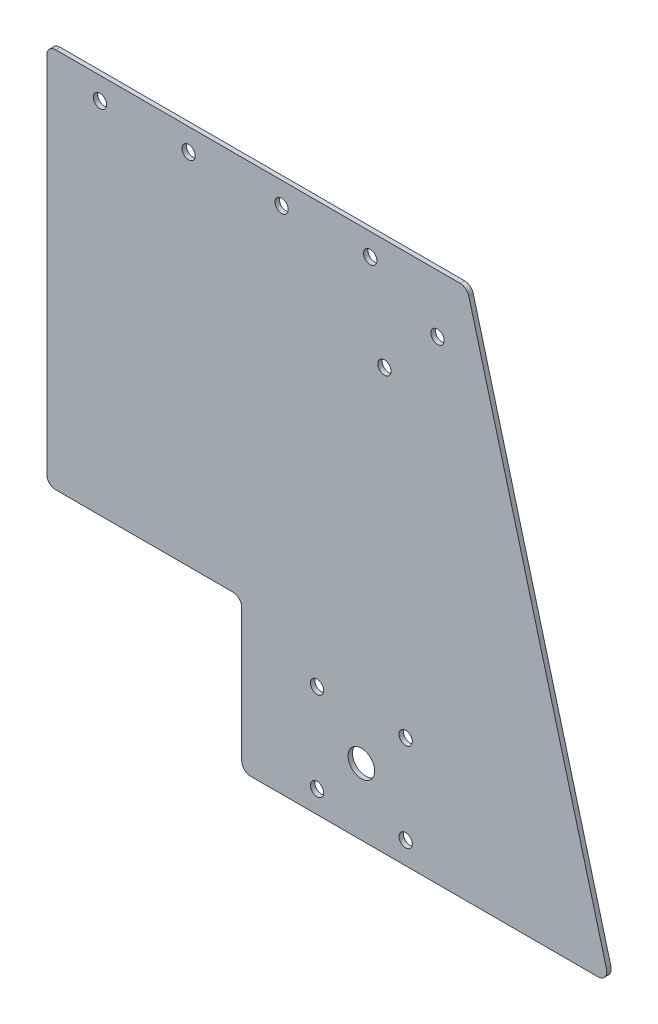
ISO-10303-21;
HEADER;
FILE_DESCRIPTION(('STEP AP214'),'2;1');
FILE_NAME('part.step','',(''),(''),'','','');
FILE_SCHEMA(('AUTOMOTIVE_DESIGN { 1 0 10303 214 1 1 1 1 }'));
ENDSEC;
DATA;
#1=APPLICATION_CONTEXT('core data for automotive mechanical design processes');
#2=APPLICATION_PROTOCOL_DEFINITION('international standard','automotive_design',2000,#1);
#3=PRODUCT_CONTEXT('',#1,'mechanical');
#4=PRODUCT('Part','Part','',(#3));
#5=PRODUCT_RELATED_PRODUCT_CATEGORY('part','',(#4));
#6=PRODUCT_DEFINITION_FORMATION('','',#4);
#7=PRODUCT_DEFINITION_CONTEXT('part definition',#1,'design');
#8=PRODUCT_DEFINITION('design','',#6,#7);
#9=PRODUCT_DEFINITION_SHAPE('','',#8);
#10=(LENGTH_UNIT() NAMED_UNIT(*) SI_UNIT(.MILLI.,.METRE.));
#11=(NAMED_UNIT(*) PLANE_ANGLE_UNIT() SI_UNIT($,.RADIAN.));
#12=(NAMED_UNIT(*) SI_UNIT($,.STERADIAN.) SOLID_ANGLE_UNIT());
#13=UNCERTAINTY_MEASURE_WITH_UNIT(LENGTH_MEASURE(1.E-05),#10,'distance_accuracy_value','');
#14=(GEOMETRIC_REPRESENTATION_CONTEXT(3) GLOBAL_UNCERTAINTY_ASSIGNED_CONTEXT((#13)) GLOBAL_UNIT_ASSIGNED_CONTEXT((#10,
#11,#12)) REPRESENTATION_CONTEXT('',''));
#15=CARTESIAN_POINT('',(0.,0.,0.));
#16=DIRECTION('',(0.,0.,1.));
#17=DIRECTION('',(1.,0.,0.));
#18=AXIS2_PLACEMENT_3D('',#15,#16,#17);
#19=CARTESIAN_POINT('',(0.,0.,1.));
#20=DIRECTION('',(0.,0.,1.));
#21=DIRECTION('',(1.,0.,0.));
#22=AXIS2_PLACEMENT_3D('',#19,#20,#21);
#23=PLANE('',#22);
#24=DIRECTION('',(0.,1.,0.));
#25=VECTOR('',#24,1.);
#26=CARTESIAN_POINT('',(48.,0.,1.));
#27=LINE('',#26,#25);
#28=CARTESIAN_POINT('',(48.,36.,1.));
#29=VERTEX_POINT('',#28);
#30=CARTESIAN_POINT('',(48.,118.,1.));
#31=VERTEX_POINT('',#30);
#32=EDGE_CURVE('E266',#29,#31,#27,.T.);
#33=ORIENTED_EDGE('',*,*,#32,.F.);
#34=CARTESIAN_POINT('',(50.,36.,1.));
#35=DIRECTION('',(0.,0.,1.));
#36=DIRECTION('',(1.,0.,0.));
#37=AXIS2_PLACEMENT_3D('',#34,#35,#36);
#38=CIRCLE('',#37,2.);
#39=CARTESIAN_POINT('',(50.,34.,1.));
#40=VERTEX_POINT('',#39);
#41=EDGE_CURVE('E51',#29,#40,#38,.T.);
#42=ORIENTED_EDGE('',*,*,#41,.T.);
#43=DIRECTION('',(-1.,0.,0.));
#44=VECTOR('',#43,1.);
#45=CARTESIAN_POINT('',(0.,34.,1.));
#46=LINE('',#45,#44);
#47=CARTESIAN_POINT('',(90.,34.,1.));
#48=VERTEX_POINT('',#47);
#49=EDGE_CURVE('E150',#48,#40,#46,.T.);
#50=ORIENTED_EDGE('',*,*,#49,.F.);
#51=CARTESIAN_POINT('',(90.,32.,1.));
#52=DIRECTION('',(0.,0.,1.));
#53=DIRECTION('',(1.,0.,0.));
#54=AXIS2_PLACEMENT_3D('',#51,#52,#53);
#55=CIRCLE('',#54,2.);
#56=CARTESIAN_POINT('',(92.,32.,1.));
#57=VERTEX_POINT('',#56);
#58=EDGE_CURVE('E133',#48,#57,#55,.F.);
#59=ORIENTED_EDGE('',*,*,#58,.T.);
#60=DIRECTION('',(0.,1.,0.));
#61=VECTOR('',#60,1.);
#62=CARTESIAN_POINT('',(92.,0.,1.));
#63=LINE('',#62,#61);
#64=CARTESIAN_POINT('',(92.,2.,1.));
#65=VERTEX_POINT('',#64);
#66=EDGE_CURVE('E164',#65,#57,#63,.T.);
#67=ORIENTED_EDGE('',*,*,#66,.F.);
#68=CARTESIAN_POINT('',(94.,2.,1.));
#69=DIRECTION('',(0.,0.,1.));
#70=DIRECTION('',(1.,0.,0.));
#71=AXIS2_PLACEMENT_3D('',#68,#69,#70);
#72=CIRCLE('',#71,2.);
#73=CARTESIAN_POINT('',(94.,0.,1.));
#74=VERTEX_POINT('',#73);
#75=EDGE_CURVE('E219',#65,#74,#72,.T.);
#76=ORIENTED_EDGE('',*,*,#75,.T.);
#77=DIRECTION('',(1.,0.,0.));
#78=VECTOR('',#77,1.);
#79=CARTESIAN_POINT('',(0.,0.,1.));
#80=LINE('',#79,#78);
#81=CARTESIAN_POINT('',(172.393549254318,0.,1.));
#82=VERTEX_POINT('',#81);
#83=EDGE_CURVE('E210',#74,#82,#80,.T.);
#84=ORIENTED_EDGE('',*,*,#83,.T.);
#85=CARTESIAN_POINT('',(172.393549254318,2.,1.));
#86=DIRECTION('',(0.,0.,1.));
#87=DIRECTION('',(1.,0.,0.));
#88=AXIS2_PLACEMENT_3D('',#85,#86,#87);
#89=CIRCLE('',#88,2.);
#90=CARTESIAN_POINT('',(174.325400906896,2.51763809020506,1.));
#91=VERTEX_POINT('',#90);
#92=EDGE_CURVE('E227',#82,#91,#89,.T.);
#93=ORIENTED_EDGE('',*,*,#92,.T.);
#94=DIRECTION('',(-0.258819045102525,0.965925826289067,0.));
#95=VECTOR('',#94,1.);
#96=CARTESIAN_POINT('',(175.,0.,1.));
#97=LINE('',#96,#95);
#98=CARTESIAN_POINT('',(143.243294584885,118.517638090205,1.));
#99=VERTEX_POINT('',#98);
#100=EDGE_CURVE('E213',#91,#99,#97,.T.);
#101=ORIENTED_EDGE('',*,*,#100,.T.);
#102=CARTESIAN_POINT('',(141.311442932307,118.,1.));
#103=DIRECTION('',(0.,0.,1.));
#104=DIRECTION('',(1.,0.,0.));
#105=AXIS2_PLACEMENT_3D('',#102,#103,#104);
#106=CIRCLE('',#105,2.);
#107=CARTESIAN_POINT('',(141.311442932307,120.,1.));
#108=VERTEX_POINT('',#107);
#109=EDGE_CURVE('E155',#99,#108,#106,.T.);
#110=ORIENTED_EDGE('',*,*,#109,.T.);
#111=DIRECTION('',(-1.,0.,0.));
#112=VECTOR('',#111,1.);
#113=CARTESIAN_POINT('',(142.846096908265,120.,1.));
#114=LINE('',#113,#112);
#115=CARTESIAN_POINT('',(50.,120.,1.));
#116=VERTEX_POINT('',#115);
#117=EDGE_CURVE('E217',#108,#116,#114,.T.);
#118=ORIENTED_EDGE('',*,*,#117,.T.);
#119=CARTESIAN_POINT('',(50.,118.,0.999999999999999));
#120=DIRECTION('',(0.,0.,1.));
#121=DIRECTION('',(1.,0.,0.));
#122=AXIS2_PLACEMENT_3D('',#119,#120,#121);
#123=CIRCLE('',#122,2.);
#124=EDGE_CURVE('E63',#116,#31,#123,.T.);
#125=ORIENTED_EDGE('',*,*,#124,.T.);
#126=EDGE_LOOP('',(#33,#42,#50,#59,#67,#76,#84,#93,#101,#110,#118,#125));
#127=FACE_BOUND('',#126,.T.);
#128=CARTESIAN_POINT('',(121.,115.,1.));
#129=DIRECTION('',(0.,0.,1.));
#130=DIRECTION('',(1.,0.,0.));
#131=AXIS2_PLACEMENT_3D('',#128,#129,#130);
#132=CIRCLE('',#131,1.5);
#133=CARTESIAN_POINT('',(122.5,115.,1.));
#134=VERTEX_POINT('',#133);
#135=EDGE_CURVE('E636',#134,#134,#132,.T.);
#136=ORIENTED_EDGE('',*,*,#135,.F.);
#137=EDGE_LOOP('',(#136));
#138=FACE_BOUND('',#137,.T.);
#139=CARTESIAN_POINT('',(101.,115.,1.));
#140=DIRECTION('',(0.,0.,1.));
#141=DIRECTION('',(1.,0.,0.));
#142=AXIS2_PLACEMENT_3D('',#139,#140,#141);
#143=CIRCLE('',#142,1.5);
#144=CARTESIAN_POINT('',(102.5,115.,1.));
#145=VERTEX_POINT('',#144);
#146=EDGE_CURVE('E640',#145,#145,#143,.T.);
#147=ORIENTED_EDGE('',*,*,#146,.F.);
#148=EDGE_LOOP('',(#147));
#149=FACE_BOUND('',#148,.T.);
#150=CARTESIAN_POINT('',(80.,115.,1.));
#151=DIRECTION('',(0.,0.,1.));
#152=DIRECTION('',(1.,0.,0.));
#153=AXIS2_PLACEMENT_3D('',#150,#151,#152);
#154=CIRCLE('',#153,1.5);
#155=CARTESIAN_POINT('',(81.5,115.,1.));
#156=VERTEX_POINT('',#155);
#157=EDGE_CURVE('E630',#156,#156,#154,.T.);
#158=ORIENTED_EDGE('',*,*,#157,.F.);
#159=EDGE_LOOP('',(#158));
#160=FACE_BOUND('',#159,.T.);
#161=CARTESIAN_POINT('',(60.,115.,1.));
#162=DIRECTION('',(0.,0.,1.));
#163=DIRECTION('',(1.,0.,0.));
#164=AXIS2_PLACEMENT_3D('',#161,#162,#163);
#165=CIRCLE('',#164,1.5);
#166=CARTESIAN_POINT('',(61.5,115.,1.));
#167=VERTEX_POINT('',#166);
#168=EDGE_CURVE('E625',#167,#167,#165,.T.);
#169=ORIENTED_EDGE('',*,*,#168,.F.);
#170=EDGE_LOOP('',(#169));
#171=FACE_BOUND('',#170,.T.);
#172=CARTESIAN_POINT('',(136.2,107.,0.999999999999999));
#173=DIRECTION('',(0.,0.,1.));
#174=DIRECTION('',(1.,0.,0.));
#175=AXIS2_PLACEMENT_3D('',#172,#173,#174);
#176=CIRCLE('',#175,1.5);
#177=CARTESIAN_POINT('',(137.7,107.,0.999999999999999));
#178=VERTEX_POINT('',#177);
#179=EDGE_CURVE('E176',#178,#178,#176,.T.);
#180=ORIENTED_EDGE('',*,*,#179,.F.);
#181=EDGE_LOOP('',(#180));
#182=FACE_BOUND('',#181,.T.);
#183=CARTESIAN_POINT('',(124.2,95.,0.999999999999999));
#184=DIRECTION('',(0.,0.,1.));
#185=DIRECTION('',(1.,0.,0.));
#186=AXIS2_PLACEMENT_3D('',#183,#184,#185);
#187=CIRCLE('',#186,1.5);
#188=CARTESIAN_POINT('',(125.7,95.,0.999999999999999));
#189=VERTEX_POINT('',#188);
#190=EDGE_CURVE('E171',#189,#189,#187,.T.);
#191=ORIENTED_EDGE('',*,*,#190,.F.);
#192=EDGE_LOOP('',(#191));
#193=FACE_BOUND('',#192,.T.);
#194=CARTESIAN_POINT('',(109.,5.00000000000001,1.));
#195=DIRECTION('',(0.,0.,1.));
#196=DIRECTION('',(1.,0.,0.));
#197=AXIS2_PLACEMENT_3D('',#194,#195,#196);
#198=CIRCLE('',#197,1.5);
#199=CARTESIAN_POINT('',(110.5,5.00000000000001,1.));
#200=VERTEX_POINT('',#199);
#201=EDGE_CURVE('E186',#200,#200,#198,.T.);
#202=ORIENTED_EDGE('',*,*,#201,.F.);
#203=EDGE_LOOP('',(#202));
#204=FACE_BOUND('',#203,.T.);
#205=CARTESIAN_POINT('',(129.,5.00000000000001,1.));
#206=DIRECTION('',(0.,0.,1.));
#207=DIRECTION('',(1.,0.,0.));
#208=AXIS2_PLACEMENT_3D('',#205,#206,#207);
#209=CIRCLE('',#208,1.5);
#210=CARTESIAN_POINT('',(130.5,5.00000000000001,1.));
#211=VERTEX_POINT('',#210);
#212=EDGE_CURVE('E198',#211,#211,#209,.T.);
#213=ORIENTED_EDGE('',*,*,#212,.F.);
#214=EDGE_LOOP('',(#213));
#215=FACE_BOUND('',#214,.T.);
#216=CARTESIAN_POINT('',(129.,25.,1.));
#217=DIRECTION('',(0.,0.,1.));
#218=DIRECTION('',(1.,0.,0.));
#219=AXIS2_PLACEMENT_3D('',#216,#217,#218);
#220=CIRCLE('',#219,1.5);
#221=CARTESIAN_POINT('',(130.5,25.,1.));
#222=VERTEX_POINT('',#221);
#223=EDGE_CURVE('E204',#222,#222,#220,.T.);
#224=ORIENTED_EDGE('',*,*,#223,.F.);
#225=EDGE_LOOP('',(#224));
#226=FACE_BOUND('',#225,.T.);
#227=CARTESIAN_POINT('',(119.,15.,1.));
#228=DIRECTION('',(0.,0.,1.));
#229=DIRECTION('',(1.,0.,0.));
#230=AXIS2_PLACEMENT_3D('',#227,#228,#229);
#231=CIRCLE('',#230,3.00000000000001);
#232=CARTESIAN_POINT('',(122.,15.,1.));
#233=VERTEX_POINT('',#232);
#234=EDGE_CURVE('E192',#233,#233,#231,.T.);
#235=ORIENTED_EDGE('',*,*,#234,.F.);
#236=EDGE_LOOP('',(#235));
#237=FACE_BOUND('',#236,.T.);
#238=CARTESIAN_POINT('',(109.,25.,1.));
#239=DIRECTION('',(0.,0.,1.));
#240=DIRECTION('',(1.,0.,0.));
#241=AXIS2_PLACEMENT_3D('',#238,#239,#240);
#242=CIRCLE('',#241,1.5);
#243=CARTESIAN_POINT('',(110.5,25.,1.));
#244=VERTEX_POINT('',#243);
#245=EDGE_CURVE('E180',#244,#244,#242,.T.);
#246=ORIENTED_EDGE('',*,*,#245,.F.);
#247=EDGE_LOOP('',(#246));
#248=FACE_BOUND('',#247,.T.);
#249=ADVANCED_FACE('F43',(#127,#138,#149,#160,#171,#182,#193,#204,#215,#226,#237,#248),#23,.T.);
#250=CARTESIAN_POINT('',(0.,0.,0.));
#251=DIRECTION('',(0.,0.,1.));
#252=DIRECTION('',(1.,0.,0.));
#253=AXIS2_PLACEMENT_3D('',#250,#251,#252);
#254=PLANE('',#253);
#255=CARTESIAN_POINT('',(121.,115.,0.));
#256=DIRECTION('',(0.,0.,1.));
#257=DIRECTION('',(1.,0.,0.));
#258=AXIS2_PLACEMENT_3D('',#255,#256,#257);
#259=CIRCLE('',#258,1.5);
#260=CARTESIAN_POINT('',(122.5,115.,0.));
#261=VERTEX_POINT('',#260);
#262=EDGE_CURVE('E634',#261,#261,#259,.T.);
#263=ORIENTED_EDGE('',*,*,#262,.T.);
#264=EDGE_LOOP('',(#263));
#265=FACE_BOUND('',#264,.T.);
#266=CARTESIAN_POINT('',(101.,115.,0.));
#267=DIRECTION('',(0.,0.,1.));
#268=DIRECTION('',(1.,0.,0.));
#269=AXIS2_PLACEMENT_3D('',#266,#267,#268);
#270=CIRCLE('',#269,1.5);
#271=CARTESIAN_POINT('',(102.5,115.,0.));
#272=VERTEX_POINT('',#271);
#273=EDGE_CURVE('E646',#272,#272,#270,.T.);
#274=ORIENTED_EDGE('',*,*,#273,.T.);
#275=EDGE_LOOP('',(#274));
#276=FACE_BOUND('',#275,.T.);
#277=CARTESIAN_POINT('',(80.,115.,0.));
#278=DIRECTION('',(0.,0.,1.));
#279=DIRECTION('',(1.,0.,0.));
#280=AXIS2_PLACEMENT_3D('',#277,#278,#279);
#281=CIRCLE('',#280,1.5);
#282=CARTESIAN_POINT('',(81.5,115.,0.));
#283=VERTEX_POINT('',#282);
#284=EDGE_CURVE('E627',#283,#283,#281,.T.);
#285=ORIENTED_EDGE('',*,*,#284,.T.);
#286=EDGE_LOOP('',(#285));
#287=FACE_BOUND('',#286,.T.);
#288=CARTESIAN_POINT('',(60.,115.,0.));
#289=DIRECTION('',(0.,0.,1.));
#290=DIRECTION('',(1.,0.,0.));
#291=AXIS2_PLACEMENT_3D('',#288,#289,#290);
#292=CIRCLE('',#291,1.5);
#293=CARTESIAN_POINT('',(61.5,115.,0.));
#294=VERTEX_POINT('',#293);
#295=EDGE_CURVE('E271',#294,#294,#292,.T.);
#296=ORIENTED_EDGE('',*,*,#295,.T.);
#297=EDGE_LOOP('',(#296));
#298=FACE_BOUND('',#297,.T.);
#299=CARTESIAN_POINT('',(136.2,107.,0.));
#300=DIRECTION('',(0.,0.,-1.));
#301=DIRECTION('',(-1.,0.,0.));
#302=AXIS2_PLACEMENT_3D('',#299,#300,#301);
#303=CIRCLE('',#302,1.5);
#304=CARTESIAN_POINT('',(134.7,107.,0.));
#305=VERTEX_POINT('',#304);
#306=EDGE_CURVE('E168',#305,#305,#303,.T.);
#307=ORIENTED_EDGE('',*,*,#306,.F.);
#308=EDGE_LOOP('',(#307));
#309=FACE_BOUND('',#308,.T.);
#310=CARTESIAN_POINT('',(124.2,95.,0.));
#311=DIRECTION('',(0.,0.,-1.));
#312=DIRECTION('',(-1.,0.,0.));
#313=AXIS2_PLACEMENT_3D('',#310,#311,#312);
#314=CIRCLE('',#313,1.5);
#315=CARTESIAN_POINT('',(122.7,95.,0.));
#316=VERTEX_POINT('',#315);
#317=EDGE_CURVE('E161',#316,#316,#314,.T.);
#318=ORIENTED_EDGE('',*,*,#317,.F.);
#319=EDGE_LOOP('',(#318));
#320=FACE_BOUND('',#319,.T.);
#321=DIRECTION('',(-1.,0.,0.));
#322=VECTOR('',#321,1.);
#323=CARTESIAN_POINT('',(0.,34.,0.));
#324=LINE('',#323,#322);
#325=CARTESIAN_POINT('',(90.,34.,0.));
#326=VERTEX_POINT('',#325);
#327=CARTESIAN_POINT('',(50.,34.,0.));
#328=VERTEX_POINT('',#327);
#329=EDGE_CURVE('E153',#326,#328,#324,.T.);
#330=ORIENTED_EDGE('',*,*,#329,.T.);
#331=CARTESIAN_POINT('',(50.,36.,0.));
#332=DIRECTION('',(0.,0.,1.));
#333=DIRECTION('',(1.,0.,0.));
#334=AXIS2_PLACEMENT_3D('',#331,#332,#333);
#335=CIRCLE('',#334,2.);
#336=CARTESIAN_POINT('',(48.,36.,0.));
#337=VERTEX_POINT('',#336);
#338=EDGE_CURVE('E255',#328,#337,#335,.F.);
#339=ORIENTED_EDGE('',*,*,#338,.T.);
#340=DIRECTION('',(0.,-1.,0.));
#341=VECTOR('',#340,1.);
#342=CARTESIAN_POINT('',(48.,120.,0.));
#343=LINE('',#342,#341);
#344=CARTESIAN_POINT('',(48.,118.,0.));
#345=VERTEX_POINT('',#344);
#346=EDGE_CURVE('E269',#345,#337,#343,.T.);
#347=ORIENTED_EDGE('',*,*,#346,.F.);
#348=CARTESIAN_POINT('',(50.,118.,0.));
#349=DIRECTION('',(0.,0.,1.));
#350=DIRECTION('',(1.,0.,0.));
#351=AXIS2_PLACEMENT_3D('',#348,#349,#350);
#352=CIRCLE('',#351,2.);
#353=CARTESIAN_POINT('',(50.,120.,0.));
#354=VERTEX_POINT('',#353);
#355=EDGE_CURVE('E253',#345,#354,#352,.F.);
#356=ORIENTED_EDGE('',*,*,#355,.T.);
#357=DIRECTION('',(-1.,0.,0.));
#358=VECTOR('',#357,1.);
#359=CARTESIAN_POINT('',(142.846096908265,120.,0.));
#360=LINE('',#359,#358);
#361=CARTESIAN_POINT('',(141.311442932307,120.,0.));
#362=VERTEX_POINT('',#361);
#363=EDGE_CURVE('E214',#362,#354,#360,.T.);
#364=ORIENTED_EDGE('',*,*,#363,.F.);
#365=CARTESIAN_POINT('',(141.311442932307,118.,0.));
#366=DIRECTION('',(0.,0.,1.));
#367=DIRECTION('',(1.,0.,0.));
#368=AXIS2_PLACEMENT_3D('',#365,#366,#367);
#369=CIRCLE('',#368,2.);
#370=CARTESIAN_POINT('',(143.243294584885,118.517638090205,0.));
#371=VERTEX_POINT('',#370);
#372=EDGE_CURVE('E233',#362,#371,#369,.F.);
#373=ORIENTED_EDGE('',*,*,#372,.T.);
#374=DIRECTION('',(-0.258819045102525,0.965925826289067,0.));
#375=VECTOR('',#374,1.);
#376=CARTESIAN_POINT('',(175.,0.,0.));
#377=LINE('',#376,#375);
#378=CARTESIAN_POINT('',(174.325400906896,2.51763809020506,0.));
#379=VERTEX_POINT('',#378);
#380=EDGE_CURVE('E222',#379,#371,#377,.T.);
#381=ORIENTED_EDGE('',*,*,#380,.F.);
#382=CARTESIAN_POINT('',(172.393549254318,2.,0.));
#383=DIRECTION('',(0.,0.,1.));
#384=DIRECTION('',(1.,0.,0.));
#385=AXIS2_PLACEMENT_3D('',#382,#383,#384);
#386=CIRCLE('',#385,2.);
#387=CARTESIAN_POINT('',(172.393549254318,0.,0.));
#388=VERTEX_POINT('',#387);
#389=EDGE_CURVE('E231',#379,#388,#386,.F.);
#390=ORIENTED_EDGE('',*,*,#389,.T.);
#391=DIRECTION('',(1.,0.,0.));
#392=VECTOR('',#391,1.);
#393=CARTESIAN_POINT('',(0.,0.,0.));
#394=LINE('',#393,#392);
#395=CARTESIAN_POINT('',(94.,0.,0.));
#396=VERTEX_POINT('',#395);
#397=EDGE_CURVE('E207',#396,#388,#394,.T.);
#398=ORIENTED_EDGE('',*,*,#397,.F.);
#399=CARTESIAN_POINT('',(94.,2.,0.));
#400=DIRECTION('',(0.,0.,1.));
#401=DIRECTION('',(1.,0.,0.));
#402=AXIS2_PLACEMENT_3D('',#399,#400,#401);
#403=CIRCLE('',#402,2.);
#404=CARTESIAN_POINT('',(92.,2.,0.));
#405=VERTEX_POINT('',#404);
#406=EDGE_CURVE('E154',#396,#405,#403,.F.);
#407=ORIENTED_EDGE('',*,*,#406,.T.);
#408=DIRECTION('',(0.,1.,0.));
#409=VECTOR('',#408,1.);
#410=CARTESIAN_POINT('',(92.,0.,0.));
#411=LINE('',#410,#409);
#412=CARTESIAN_POINT('',(92.,32.,0.));
#413=VERTEX_POINT('',#412);
#414=EDGE_CURVE('E159',#405,#413,#411,.T.);
#415=ORIENTED_EDGE('',*,*,#414,.T.);
#416=CARTESIAN_POINT('',(90.,32.,0.));
#417=DIRECTION('',(0.,0.,1.));
#418=DIRECTION('',(1.,0.,0.));
#419=AXIS2_PLACEMENT_3D('',#416,#417,#418);
#420=CIRCLE('',#419,2.);
#421=EDGE_CURVE('E142',#413,#326,#420,.T.);
#422=ORIENTED_EDGE('',*,*,#421,.T.);
#423=EDGE_LOOP('',(#330,#339,#347,#356,#364,#373,#381,#390,#398,#407,#415,#422));
#424=FACE_BOUND('',#423,.T.);
#425=CARTESIAN_POINT('',(129.,25.,0.));
#426=DIRECTION('',(0.,0.,1.));
#427=DIRECTION('',(1.,0.,0.));
#428=AXIS2_PLACEMENT_3D('',#425,#426,#427);
#429=CIRCLE('',#428,1.5);
#430=CARTESIAN_POINT('',(130.5,25.,0.));
#431=VERTEX_POINT('',#430);
#432=EDGE_CURVE('E201',#431,#431,#429,.T.);
#433=ORIENTED_EDGE('',*,*,#432,.T.);
#434=EDGE_LOOP('',(#433));
#435=FACE_BOUND('',#434,.T.);
#436=CARTESIAN_POINT('',(129.,5.00000000000001,0.));
#437=DIRECTION('',(0.,0.,1.));
#438=DIRECTION('',(1.,0.,0.));
#439=AXIS2_PLACEMENT_3D('',#436,#437,#438);
#440=CIRCLE('',#439,1.5);
#441=CARTESIAN_POINT('',(130.5,5.00000000000001,0.));
#442=VERTEX_POINT('',#441);
#443=EDGE_CURVE('E195',#442,#442,#440,.T.);
#444=ORIENTED_EDGE('',*,*,#443,.T.);
#445=EDGE_LOOP('',(#444));
#446=FACE_BOUND('',#445,.T.);
#447=CARTESIAN_POINT('',(119.,15.,0.));
#448=DIRECTION('',(0.,0.,1.));
#449=DIRECTION('',(1.,0.,0.));
#450=AXIS2_PLACEMENT_3D('',#447,#448,#449);
#451=CIRCLE('',#450,3.00000000000001);
#452=CARTESIAN_POINT('',(122.,15.,0.));
#453=VERTEX_POINT('',#452);
#454=EDGE_CURVE('E189',#453,#453,#451,.T.);
#455=ORIENTED_EDGE('',*,*,#454,.T.);
#456=EDGE_LOOP('',(#455));
#457=FACE_BOUND('',#456,.T.);
#458=CARTESIAN_POINT('',(109.,5.00000000000001,0.));
#459=DIRECTION('',(0.,0.,1.));
#460=DIRECTION('',(1.,0.,0.));
#461=AXIS2_PLACEMENT_3D('',#458,#459,#460);
#462=CIRCLE('',#461,1.5);
#463=CARTESIAN_POINT('',(110.5,5.00000000000001,0.));
#464=VERTEX_POINT('',#463);
#465=EDGE_CURVE('E183',#464,#464,#462,.T.);
#466=ORIENTED_EDGE('',*,*,#465,.T.);
#467=EDGE_LOOP('',(#466));
#468=FACE_BOUND('',#467,.T.);
#469=CARTESIAN_POINT('',(109.,25.,0.));
#470=DIRECTION('',(0.,0.,1.));
#471=DIRECTION('',(1.,0.,0.));
#472=AXIS2_PLACEMENT_3D('',#469,#470,#471);
#473=CIRCLE('',#472,1.5);
#474=CARTESIAN_POINT('',(110.5,25.,0.));
#475=VERTEX_POINT('',#474);
#476=EDGE_CURVE('E179',#475,#475,#473,.T.);
#477=ORIENTED_EDGE('',*,*,#476,.T.);
#478=EDGE_LOOP('',(#477));
#479=FACE_BOUND('',#478,.T.);
#480=ADVANCED_FACE('F275',(#265,#276,#287,#298,#309,#320,#424,#435,#446,#457,#468,#479),#254,.F.);
#481=CARTESIAN_POINT('',(0.,0.,1.));
#482=DIRECTION('',(0.,1.,0.));
#483=DIRECTION('',(0.,0.,1.));
#484=AXIS2_PLACEMENT_3D('',#481,#482,#483);
#485=PLANE('',#484);
#486=ORIENTED_EDGE('',*,*,#397,.T.);
#487=DIRECTION('',(0.,0.,-1.));
#488=VECTOR('',#487,1.);
#489=CARTESIAN_POINT('',(172.393549254318,0.,1.));
#490=LINE('',#489,#488);
#491=EDGE_CURVE('E245',#388,#82,#490,.F.);
#492=ORIENTED_EDGE('',*,*,#491,.T.);
#493=ORIENTED_EDGE('',*,*,#83,.F.);
#494=DIRECTION('',(0.,0.,1.));
#495=VECTOR('',#494,1.);
#496=CARTESIAN_POINT('',(94.,0.,1.));
#497=LINE('',#496,#495);
#498=EDGE_CURVE('E243',#74,#396,#497,.F.);
#499=ORIENTED_EDGE('',*,*,#498,.T.);
#500=EDGE_LOOP('',(#486,#492,#493,#499));
#501=FACE_BOUND('',#500,.T.);
#502=ADVANCED_FACE('F289',(#501),#485,.F.);
#503=CARTESIAN_POINT('',(175.,0.,1.));
#504=DIRECTION('',(-0.965925826289067,-0.258819045102525,0.));
#505=DIRECTION('',(0.258819045102525,-0.965925826289067,0.));
#506=AXIS2_PLACEMENT_3D('',#503,#504,#505);
#507=PLANE('',#506);
#508=ORIENTED_EDGE('',*,*,#380,.T.);
#509=DIRECTION('',(0.,0.,-1.));
#510=VECTOR('',#509,1.);
#511=CARTESIAN_POINT('',(143.243294584885,118.517638090205,1.));
#512=LINE('',#511,#510);
#513=EDGE_CURVE('E241',#371,#99,#512,.F.);
#514=ORIENTED_EDGE('',*,*,#513,.T.);
#515=ORIENTED_EDGE('',*,*,#100,.F.);
#516=DIRECTION('',(0.,0.,-1.));
#517=VECTOR('',#516,1.);
#518=CARTESIAN_POINT('',(174.325400906896,2.51763809020506,1.));
#519=LINE('',#518,#517);
#520=EDGE_CURVE('E238',#91,#379,#519,.T.);
#521=ORIENTED_EDGE('',*,*,#520,.T.);
#522=EDGE_LOOP('',(#508,#514,#515,#521));
#523=FACE_BOUND('',#522,.T.);
#524=ADVANCED_FACE('F297',(#523),#507,.F.);
#525=CARTESIAN_POINT('',(142.846096908265,120.,1.));
#526=DIRECTION('',(0.,-1.,0.));
#527=DIRECTION('',(1.,0.,0.));
#528=AXIS2_PLACEMENT_3D('',#525,#526,#527);
#529=PLANE('',#528);
#530=ORIENTED_EDGE('',*,*,#363,.T.);
#531=DIRECTION('',(0.,0.,-1.));
#532=VECTOR('',#531,1.);
#533=CARTESIAN_POINT('',(50.,120.,1.));
#534=LINE('',#533,#532);
#535=EDGE_CURVE('E11',#354,#116,#534,.F.);
#536=ORIENTED_EDGE('',*,*,#535,.T.);
#537=ORIENTED_EDGE('',*,*,#117,.F.);
#538=DIRECTION('',(0.,0.,-1.));
#539=VECTOR('',#538,1.);
#540=CARTESIAN_POINT('',(141.311442932307,120.,1.));
#541=LINE('',#540,#539);
#542=EDGE_CURVE('E235',#108,#362,#541,.T.);
#543=ORIENTED_EDGE('',*,*,#542,.T.);
#544=EDGE_LOOP('',(#530,#536,#537,#543));
#545=FACE_BOUND('',#544,.T.);
#546=ADVANCED_FACE('F303',(#545),#529,.F.);
#547=CARTESIAN_POINT('',(129.,25.,1.));
#548=DIRECTION('',(0.,0.,-1.));
#549=DIRECTION('',(-1.,0.,0.));
#550=AXIS2_PLACEMENT_3D('',#547,#548,#549);
#551=CYLINDRICAL_SURFACE('',#550,1.5);
#552=ORIENTED_EDGE('',*,*,#223,.T.);
#553=EDGE_LOOP('',(#552));
#554=FACE_BOUND('',#553,.T.);
#555=ORIENTED_EDGE('',*,*,#432,.F.);
#556=EDGE_LOOP('',(#555));
#557=FACE_BOUND('',#556,.T.);
#558=ADVANCED_FACE('F318',(#554,#557),#551,.F.);
#559=CARTESIAN_POINT('',(129.,5.00000000000001,1.));
#560=DIRECTION('',(0.,0.,-1.));
#561=DIRECTION('',(-1.,0.,0.));
#562=AXIS2_PLACEMENT_3D('',#559,#560,#561);
#563=CYLINDRICAL_SURFACE('',#562,1.5);
#564=ORIENTED_EDGE('',*,*,#212,.T.);
#565=EDGE_LOOP('',(#564));
#566=FACE_BOUND('',#565,.T.);
#567=ORIENTED_EDGE('',*,*,#443,.F.);
#568=EDGE_LOOP('',(#567));
#569=FACE_BOUND('',#568,.T.);
#570=ADVANCED_FACE('F379',(#566,#569),#563,.F.);
#571=CARTESIAN_POINT('',(119.,15.,1.));
#572=DIRECTION('',(0.,0.,-1.));
#573=DIRECTION('',(-1.,0.,0.));
#574=AXIS2_PLACEMENT_3D('',#571,#572,#573);
#575=CYLINDRICAL_SURFACE('',#574,3.00000000000001);
#576=ORIENTED_EDGE('',*,*,#234,.T.);
#577=EDGE_LOOP('',(#576));
#578=FACE_BOUND('',#577,.T.);
#579=ORIENTED_EDGE('',*,*,#454,.F.);
#580=EDGE_LOOP('',(#579));
#581=FACE_BOUND('',#580,.T.);
#582=ADVANCED_FACE('F376',(#578,#581),#575,.F.);
#583=CARTESIAN_POINT('',(109.,5.00000000000001,1.));
#584=DIRECTION('',(0.,0.,-1.));
#585=DIRECTION('',(-1.,0.,0.));
#586=AXIS2_PLACEMENT_3D('',#583,#584,#585);
#587=CYLINDRICAL_SURFACE('',#586,1.5);
#588=ORIENTED_EDGE('',*,*,#201,.T.);
#589=EDGE_LOOP('',(#588));
#590=FACE_BOUND('',#589,.T.);
#591=ORIENTED_EDGE('',*,*,#465,.F.);
#592=EDGE_LOOP('',(#591));
#593=FACE_BOUND('',#592,.T.);
#594=ADVANCED_FACE('F372',(#590,#593),#587,.F.);
#595=CARTESIAN_POINT('',(109.,25.,1.));
#596=DIRECTION('',(0.,0.,-1.));
#597=DIRECTION('',(-1.,0.,0.));
#598=AXIS2_PLACEMENT_3D('',#595,#596,#597);
#599=CYLINDRICAL_SURFACE('',#598,1.5);
#600=ORIENTED_EDGE('',*,*,#245,.T.);
#601=EDGE_LOOP('',(#600));
#602=FACE_BOUND('',#601,.T.);
#603=ORIENTED_EDGE('',*,*,#476,.F.);
#604=EDGE_LOOP('',(#603));
#605=FACE_BOUND('',#604,.T.);
#606=ADVANCED_FACE('F368',(#602,#605),#599,.F.);
#607=CARTESIAN_POINT('',(124.2,95.,10.));
#608=DIRECTION('',(0.,0.,-1.));
#609=DIRECTION('',(-1.,0.,0.));
#610=AXIS2_PLACEMENT_3D('',#607,#608,#609);
#611=CYLINDRICAL_SURFACE('',#610,1.5);
#612=ORIENTED_EDGE('',*,*,#190,.T.);
#613=EDGE_LOOP('',(#612));
#614=FACE_BOUND('',#613,.T.);
#615=ORIENTED_EDGE('',*,*,#317,.T.);
#616=EDGE_LOOP('',(#615));
#617=FACE_BOUND('',#616,.T.);
#618=ADVANCED_FACE('F364',(#614,#617),#611,.F.);
#619=CARTESIAN_POINT('',(136.2,107.,10.));
#620=DIRECTION('',(0.,0.,-1.));
#621=DIRECTION('',(-1.,0.,0.));
#622=AXIS2_PLACEMENT_3D('',#619,#620,#621);
#623=CYLINDRICAL_SURFACE('',#622,1.5);
#624=ORIENTED_EDGE('',*,*,#179,.T.);
#625=EDGE_LOOP('',(#624));
#626=FACE_BOUND('',#625,.T.);
#627=ORIENTED_EDGE('',*,*,#306,.T.);
#628=EDGE_LOOP('',(#627));
#629=FACE_BOUND('',#628,.T.);
#630=ADVANCED_FACE('F361',(#626,#629),#623,.F.);
#631=CARTESIAN_POINT('',(0.,34.,-9.));
#632=DIRECTION('',(0.,1.,0.));
#633=DIRECTION('',(0.,0.,1.));
#634=AXIS2_PLACEMENT_3D('',#631,#632,#633);
#635=PLANE('',#634);
#636=ORIENTED_EDGE('',*,*,#49,.T.);
#637=DIRECTION('',(0.,0.,-1.));
#638=VECTOR('',#637,1.);
#639=CARTESIAN_POINT('',(50.,34.,-9.));
#640=LINE('',#639,#638);
#641=EDGE_CURVE('E251',#40,#328,#640,.T.);
#642=ORIENTED_EDGE('',*,*,#641,.T.);
#643=ORIENTED_EDGE('',*,*,#329,.F.);
#644=DIRECTION('',(0.,0.,1.));
#645=VECTOR('',#644,1.);
#646=CARTESIAN_POINT('',(90.,34.,1.));
#647=LINE('',#646,#645);
#648=EDGE_CURVE('E137',#326,#48,#647,.T.);
#649=ORIENTED_EDGE('',*,*,#648,.T.);
#650=EDGE_LOOP('',(#636,#642,#643,#649));
#651=FACE_BOUND('',#650,.T.);
#652=ADVANCED_FACE('F148',(#651),#635,.F.);
#653=CARTESIAN_POINT('',(92.,0.,-9.));
#654=DIRECTION('',(1.,0.,0.));
#655=DIRECTION('',(0.,0.,-1.));
#656=AXIS2_PLACEMENT_3D('',#653,#654,#655);
#657=PLANE('',#656);
#658=ORIENTED_EDGE('',*,*,#414,.F.);
#659=DIRECTION('',(0.,0.,1.));
#660=VECTOR('',#659,1.);
#661=CARTESIAN_POINT('',(92.,2.,-9.));
#662=LINE('',#661,#660);
#663=EDGE_CURVE('E143',#405,#65,#662,.T.);
#664=ORIENTED_EDGE('',*,*,#663,.T.);
#665=ORIENTED_EDGE('',*,*,#66,.T.);
#666=DIRECTION('',(0.,0.,1.));
#667=VECTOR('',#666,1.);
#668=CARTESIAN_POINT('',(92.,32.,0.));
#669=LINE('',#668,#667);
#670=EDGE_CURVE('E138',#57,#413,#669,.F.);
#671=ORIENTED_EDGE('',*,*,#670,.T.);
#672=EDGE_LOOP('',(#658,#664,#665,#671));
#673=FACE_BOUND('',#672,.T.);
#674=ADVANCED_FACE('F282',(#673),#657,.F.);
#675=CARTESIAN_POINT('',(60.,115.,0.));
#676=DIRECTION('',(0.,0.,1.));
#677=DIRECTION('',(1.,0.,0.));
#678=AXIS2_PLACEMENT_3D('',#675,#676,#677);
#679=CYLINDRICAL_SURFACE('',#678,1.5);
#680=ORIENTED_EDGE('',*,*,#295,.F.);
#681=EDGE_LOOP('',(#680));
#682=FACE_BOUND('',#681,.T.);
#683=ORIENTED_EDGE('',*,*,#168,.T.);
#684=EDGE_LOOP('',(#683));
#685=FACE_BOUND('',#684,.T.);
#686=ADVANCED_FACE('F352',(#682,#685),#679,.F.);
#687=CARTESIAN_POINT('',(80.,115.,0.));
#688=DIRECTION('',(0.,0.,1.));
#689=DIRECTION('',(1.,0.,0.));
#690=AXIS2_PLACEMENT_3D('',#687,#688,#689);
#691=CYLINDRICAL_SURFACE('',#690,1.5);
#692=ORIENTED_EDGE('',*,*,#284,.F.);
#693=EDGE_LOOP('',(#692));
#694=FACE_BOUND('',#693,.T.);
#695=ORIENTED_EDGE('',*,*,#157,.T.);
#696=EDGE_LOOP('',(#695));
#697=FACE_BOUND('',#696,.T.);
#698=ADVANCED_FACE('F348',(#694,#697),#691,.F.);
#699=CARTESIAN_POINT('',(101.,115.,0.));
#700=DIRECTION('',(0.,0.,1.));
#701=DIRECTION('',(1.,0.,0.));
#702=AXIS2_PLACEMENT_3D('',#699,#700,#701);
#703=CYLINDRICAL_SURFACE('',#702,1.5);
#704=ORIENTED_EDGE('',*,*,#273,.F.);
#705=EDGE_LOOP('',(#704));
#706=FACE_BOUND('',#705,.T.);
#707=ORIENTED_EDGE('',*,*,#146,.T.);
#708=EDGE_LOOP('',(#707));
#709=FACE_BOUND('',#708,.T.);
#710=ADVANCED_FACE('F344',(#706,#709),#703,.F.);
#711=CARTESIAN_POINT('',(121.,115.,0.));
#712=DIRECTION('',(0.,0.,1.));
#713=DIRECTION('',(1.,0.,0.));
#714=AXIS2_PLACEMENT_3D('',#711,#712,#713);
#715=CYLINDRICAL_SURFACE('',#714,1.5);
#716=ORIENTED_EDGE('',*,*,#262,.F.);
#717=EDGE_LOOP('',(#716));
#718=FACE_BOUND('',#717,.T.);
#719=ORIENTED_EDGE('',*,*,#135,.T.);
#720=EDGE_LOOP('',(#719));
#721=FACE_BOUND('',#720,.T.);
#722=ADVANCED_FACE('F329',(#718,#721),#715,.F.);
#723=CARTESIAN_POINT('',(141.311442932307,118.,1.));
#724=DIRECTION('',(0.,0.,-1.));
#725=DIRECTION('',(-1.,0.,0.));
#726=AXIS2_PLACEMENT_3D('',#723,#724,#725);
#727=CYLINDRICAL_SURFACE('',#726,2.);
#728=ORIENTED_EDGE('',*,*,#109,.F.);
#729=ORIENTED_EDGE('',*,*,#513,.F.);
#730=ORIENTED_EDGE('',*,*,#372,.F.);
#731=ORIENTED_EDGE('',*,*,#542,.F.);
#732=EDGE_LOOP('',(#728,#729,#730,#731));
#733=FACE_BOUND('',#732,.T.);
#734=ADVANCED_FACE('F301',(#733),#727,.T.);
#735=CARTESIAN_POINT('',(172.393549254318,2.,1.));
#736=DIRECTION('',(0.,0.,-1.));
#737=DIRECTION('',(-1.,0.,0.));
#738=AXIS2_PLACEMENT_3D('',#735,#736,#737);
#739=CYLINDRICAL_SURFACE('',#738,2.);
#740=ORIENTED_EDGE('',*,*,#92,.F.);
#741=ORIENTED_EDGE('',*,*,#491,.F.);
#742=ORIENTED_EDGE('',*,*,#389,.F.);
#743=ORIENTED_EDGE('',*,*,#520,.F.);
#744=EDGE_LOOP('',(#740,#741,#742,#743));
#745=FACE_BOUND('',#744,.T.);
#746=ADVANCED_FACE('F292',(#745),#739,.T.);
#747=CARTESIAN_POINT('',(94.,2.,-9.));
#748=DIRECTION('',(0.,0.,1.));
#749=DIRECTION('',(1.,0.,0.));
#750=AXIS2_PLACEMENT_3D('',#747,#748,#749);
#751=CYLINDRICAL_SURFACE('',#750,2.);
#752=ORIENTED_EDGE('',*,*,#406,.F.);
#753=ORIENTED_EDGE('',*,*,#498,.F.);
#754=ORIENTED_EDGE('',*,*,#75,.F.);
#755=ORIENTED_EDGE('',*,*,#663,.F.);
#756=EDGE_LOOP('',(#752,#753,#754,#755));
#757=FACE_BOUND('',#756,.T.);
#758=ADVANCED_FACE('F284',(#757),#751,.T.);
#759=CARTESIAN_POINT('',(90.,32.,-9.));
#760=DIRECTION('',(0.,0.,-1.));
#761=DIRECTION('',(-1.,0.,0.));
#762=AXIS2_PLACEMENT_3D('',#759,#760,#761);
#763=CYLINDRICAL_SURFACE('',#762,2.);
#764=ORIENTED_EDGE('',*,*,#421,.F.);
#765=ORIENTED_EDGE('',*,*,#670,.F.);
#766=ORIENTED_EDGE('',*,*,#58,.F.);
#767=ORIENTED_EDGE('',*,*,#648,.F.);
#768=EDGE_LOOP('',(#764,#765,#766,#767));
#769=FACE_BOUND('',#768,.T.);
#770=ADVANCED_FACE('F136',(#769),#763,.F.);
#771=CARTESIAN_POINT('',(48.,120.,10.));
#772=DIRECTION('',(1.,0.,0.));
#773=DIRECTION('',(0.,1.,0.));
#774=AXIS2_PLACEMENT_3D('',#771,#772,#773);
#775=PLANE('',#774);
#776=ORIENTED_EDGE('',*,*,#346,.T.);
#777=DIRECTION('',(0.,0.,-1.));
#778=VECTOR('',#777,1.);
#779=CARTESIAN_POINT('',(48.,36.,10.));
#780=LINE('',#779,#778);
#781=EDGE_CURVE('E260',#337,#29,#780,.F.);
#782=ORIENTED_EDGE('',*,*,#781,.T.);
#783=ORIENTED_EDGE('',*,*,#32,.T.);
#784=DIRECTION('',(0.,0.,-1.));
#785=VECTOR('',#784,1.);
#786=CARTESIAN_POINT('',(48.,118.,10.));
#787=LINE('',#786,#785);
#788=EDGE_CURVE('E257',#31,#345,#787,.T.);
#789=ORIENTED_EDGE('',*,*,#788,.T.);
#790=EDGE_LOOP('',(#776,#782,#783,#789));
#791=FACE_BOUND('',#790,.T.);
#792=ADVANCED_FACE('F265',(#791),#775,.F.);
#793=CARTESIAN_POINT('',(50.,36.,-9.));
#794=DIRECTION('',(0.,0.,-1.));
#795=DIRECTION('',(-1.,0.,0.));
#796=AXIS2_PLACEMENT_3D('',#793,#794,#795);
#797=CYLINDRICAL_SURFACE('',#796,2.);
#798=ORIENTED_EDGE('',*,*,#41,.F.);
#799=ORIENTED_EDGE('',*,*,#781,.F.);
#800=ORIENTED_EDGE('',*,*,#338,.F.);
#801=ORIENTED_EDGE('',*,*,#641,.F.);
#802=EDGE_LOOP('',(#798,#799,#800,#801));
#803=FACE_BOUND('',#802,.T.);
#804=ADVANCED_FACE('F273',(#803),#797,.T.);
#805=CARTESIAN_POINT('',(50.,118.,10.));
#806=DIRECTION('',(0.,0.,-1.));
#807=DIRECTION('',(-1.,0.,0.));
#808=AXIS2_PLACEMENT_3D('',#805,#806,#807);
#809=CYLINDRICAL_SURFACE('',#808,2.);
#810=ORIENTED_EDGE('',*,*,#124,.F.);
#811=ORIENTED_EDGE('',*,*,#535,.F.);
#812=ORIENTED_EDGE('',*,*,#355,.F.);
#813=ORIENTED_EDGE('',*,*,#788,.F.);
#814=EDGE_LOOP('',(#810,#811,#812,#813));
#815=FACE_BOUND('',#814,.T.);
#816=ADVANCED_FACE('F45',(#815),#809,.T.);
#817=CLOSED_SHELL('',(#249,#480,#502,#524,#546,#558,#570,#582,#594,#606,#618,#630,#652,#674,
#686,#698,#710,#722,#734,#746,#758,#770,#792,#804,#816));
#818=MANIFOLD_SOLID_BREP('B2',#817);
#819=ADVANCED_BREP_SHAPE_REPRESENTATION('',(#18,#818),#14);
#820=SHAPE_DEFINITION_REPRESENTATION(#9,#819);
ENDSEC;
END-ISO-10303-21;
